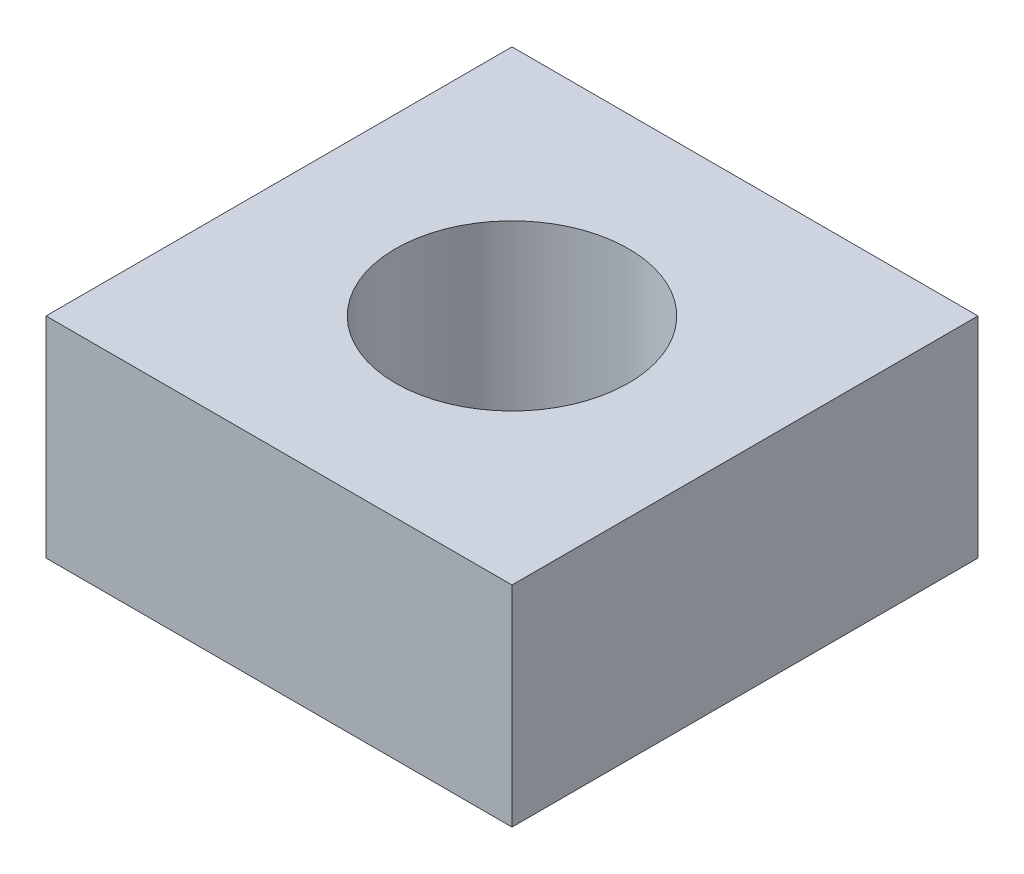
ISO-10303-21;
HEADER;
FILE_DESCRIPTION(('STEP AP214'),'2;1');
FILE_NAME('part.step','',(''),(''),'','','');
FILE_SCHEMA(('AUTOMOTIVE_DESIGN { 1 0 10303 214 1 1 1 1 }'));
ENDSEC;
DATA;
#1=APPLICATION_CONTEXT('core data for automotive mechanical design processes');
#2=APPLICATION_PROTOCOL_DEFINITION('international standard','automotive_design',2000,#1);
#3=PRODUCT_CONTEXT('',#1,'mechanical');
#4=PRODUCT('Part','Part','',(#3));
#5=PRODUCT_RELATED_PRODUCT_CATEGORY('part','',(#4));
#6=PRODUCT_DEFINITION_FORMATION('','',#4);
#7=PRODUCT_DEFINITION_CONTEXT('part definition',#1,'design');
#8=PRODUCT_DEFINITION('design','',#6,#7);
#9=PRODUCT_DEFINITION_SHAPE('','',#8);
#10=(LENGTH_UNIT() NAMED_UNIT(*) SI_UNIT(.MILLI.,.METRE.));
#11=(NAMED_UNIT(*) PLANE_ANGLE_UNIT() SI_UNIT($,.RADIAN.));
#12=(NAMED_UNIT(*) SI_UNIT($,.STERADIAN.) SOLID_ANGLE_UNIT());
#13=UNCERTAINTY_MEASURE_WITH_UNIT(LENGTH_MEASURE(1.E-05),#10,'distance_accuracy_value','');
#14=(GEOMETRIC_REPRESENTATION_CONTEXT(3) GLOBAL_UNCERTAINTY_ASSIGNED_CONTEXT((#13)) GLOBAL_UNIT_ASSIGNED_CONTEXT((#10,
#11,#12)) REPRESENTATION_CONTEXT('',''));
#15=CARTESIAN_POINT('',(0.,0.,0.));
#16=DIRECTION('',(0.,0.,1.));
#17=DIRECTION('',(1.,0.,0.));
#18=AXIS2_PLACEMENT_3D('',#15,#16,#17);
#19=CARTESIAN_POINT('',(0.,4.5,0.));
#20=DIRECTION('',(0.,1.,0.));
#21=DIRECTION('',(0.,0.,1.));
#22=AXIS2_PLACEMENT_3D('',#19,#20,#21);
#23=PLANE('',#22);
#24=DIRECTION('',(0.,0.,1.));
#25=VECTOR('',#24,1.);
#26=CARTESIAN_POINT('',(-5.,4.5,5.));
#27=LINE('',#26,#25);
#28=CARTESIAN_POINT('',(-5.,4.5,-5.));
#29=VERTEX_POINT('',#28);
#30=CARTESIAN_POINT('',(-5.,4.5,5.));
#31=VERTEX_POINT('',#30);
#32=EDGE_CURVE('E85',#29,#31,#27,.T.);
#33=ORIENTED_EDGE('',*,*,#32,.T.);
#34=DIRECTION('',(1.,0.,0.));
#35=VECTOR('',#34,1.);
#36=CARTESIAN_POINT('',(5.,4.5,5.));
#37=LINE('',#36,#35);
#38=CARTESIAN_POINT('',(5.,4.5,5.));
#39=VERTEX_POINT('',#38);
#40=EDGE_CURVE('E80',#31,#39,#37,.T.);
#41=ORIENTED_EDGE('',*,*,#40,.T.);
#42=DIRECTION('',(0.,0.,-1.));
#43=VECTOR('',#42,1.);
#44=CARTESIAN_POINT('',(5.,4.5,5.));
#45=LINE('',#44,#43);
#46=CARTESIAN_POINT('',(5.,4.5,-5.));
#47=VERTEX_POINT('',#46);
#48=EDGE_CURVE('E83',#39,#47,#45,.T.);
#49=ORIENTED_EDGE('',*,*,#48,.T.);
#50=DIRECTION('',(-1.,0.,0.));
#51=VECTOR('',#50,1.);
#52=CARTESIAN_POINT('',(5.,4.5,-5.));
#53=LINE('',#52,#51);
#54=EDGE_CURVE('E50',#47,#29,#53,.T.);
#55=ORIENTED_EDGE('',*,*,#54,.T.);
#56=EDGE_LOOP('',(#33,#41,#49,#55));
#57=FACE_BOUND('',#56,.T.);
#58=CARTESIAN_POINT('',(0.,4.5,0.));
#59=DIRECTION('',(0.,1.,0.));
#60=DIRECTION('',(0.,0.,1.));
#61=AXIS2_PLACEMENT_3D('',#58,#59,#60);
#62=CIRCLE('',#61,2.5);
#63=CARTESIAN_POINT('',(0.,4.5,2.5));
#64=VERTEX_POINT('',#63);
#65=EDGE_CURVE('E100',#64,#64,#62,.T.);
#66=ORIENTED_EDGE('',*,*,#65,.F.);
#67=EDGE_LOOP('',(#66));
#68=FACE_BOUND('',#67,.T.);
#69=ADVANCED_FACE('F33',(#57,#68),#23,.T.);
#70=CARTESIAN_POINT('',(0.,0.,0.));
#71=DIRECTION('',(0.,1.,0.));
#72=DIRECTION('',(0.,0.,1.));
#73=AXIS2_PLACEMENT_3D('',#70,#71,#72);
#74=PLANE('',#73);
#75=DIRECTION('',(0.,0.,1.));
#76=VECTOR('',#75,1.);
#77=CARTESIAN_POINT('',(-5.,0.,5.));
#78=LINE('',#77,#76);
#79=CARTESIAN_POINT('',(-5.,0.,-5.));
#80=VERTEX_POINT('',#79);
#81=CARTESIAN_POINT('',(-5.,0.,5.));
#82=VERTEX_POINT('',#81);
#83=EDGE_CURVE('E97',#80,#82,#78,.T.);
#84=ORIENTED_EDGE('',*,*,#83,.F.);
#85=DIRECTION('',(-1.,0.,0.));
#86=VECTOR('',#85,1.);
#87=CARTESIAN_POINT('',(5.,0.,-5.));
#88=LINE('',#87,#86);
#89=CARTESIAN_POINT('',(5.,0.,-5.));
#90=VERTEX_POINT('',#89);
#91=EDGE_CURVE('E73',#90,#80,#88,.T.);
#92=ORIENTED_EDGE('',*,*,#91,.F.);
#93=DIRECTION('',(0.,0.,-1.));
#94=VECTOR('',#93,1.);
#95=CARTESIAN_POINT('',(5.,0.,5.));
#96=LINE('',#95,#94);
#97=CARTESIAN_POINT('',(5.,0.,5.));
#98=VERTEX_POINT('',#97);
#99=EDGE_CURVE('E67',#98,#90,#96,.T.);
#100=ORIENTED_EDGE('',*,*,#99,.F.);
#101=DIRECTION('',(1.,0.,0.));
#102=VECTOR('',#101,1.);
#103=CARTESIAN_POINT('',(5.,0.,5.));
#104=LINE('',#103,#102);
#105=EDGE_CURVE('E89',#82,#98,#104,.T.);
#106=ORIENTED_EDGE('',*,*,#105,.F.);
#107=EDGE_LOOP('',(#84,#92,#100,#106));
#108=FACE_BOUND('',#107,.T.);
#109=CARTESIAN_POINT('',(0.,0.,0.));
#110=DIRECTION('',(0.,1.,0.));
#111=DIRECTION('',(0.,0.,1.));
#112=AXIS2_PLACEMENT_3D('',#109,#110,#111);
#113=CIRCLE('',#112,2.5);
#114=CARTESIAN_POINT('',(0.,0.,2.5));
#115=VERTEX_POINT('',#114);
#116=EDGE_CURVE('E112',#115,#115,#113,.T.);
#117=ORIENTED_EDGE('',*,*,#116,.T.);
#118=EDGE_LOOP('',(#117));
#119=FACE_BOUND('',#118,.T.);
#120=ADVANCED_FACE('F108',(#108,#119),#74,.F.);
#121=CARTESIAN_POINT('',(-5.,4.5,5.));
#122=DIRECTION('',(1.,0.,0.));
#123=DIRECTION('',(0.,0.,-1.));
#124=AXIS2_PLACEMENT_3D('',#121,#122,#123);
#125=PLANE('',#124);
#126=ORIENTED_EDGE('',*,*,#83,.T.);
#127=DIRECTION('',(0.,-1.,0.));
#128=VECTOR('',#127,1.);
#129=CARTESIAN_POINT('',(-5.,4.5,5.));
#130=LINE('',#129,#128);
#131=EDGE_CURVE('E11',#31,#82,#130,.T.);
#132=ORIENTED_EDGE('',*,*,#131,.F.);
#133=ORIENTED_EDGE('',*,*,#32,.F.);
#134=DIRECTION('',(0.,-1.,0.));
#135=VECTOR('',#134,1.);
#136=CARTESIAN_POINT('',(-5.,4.5,-5.));
#137=LINE('',#136,#135);
#138=EDGE_CURVE('E93',#29,#80,#137,.T.);
#139=ORIENTED_EDGE('',*,*,#138,.T.);
#140=EDGE_LOOP('',(#126,#132,#133,#139));
#141=FACE_BOUND('',#140,.T.);
#142=ADVANCED_FACE('F35',(#141),#125,.F.);
#143=CARTESIAN_POINT('',(5.,4.5,5.));
#144=DIRECTION('',(0.,0.,-1.));
#145=DIRECTION('',(-1.,0.,0.));
#146=AXIS2_PLACEMENT_3D('',#143,#144,#145);
#147=PLANE('',#146);
#148=ORIENTED_EDGE('',*,*,#105,.T.);
#149=DIRECTION('',(0.,-1.,0.));
#150=VECTOR('',#149,1.);
#151=CARTESIAN_POINT('',(5.,4.5,5.));
#152=LINE('',#151,#150);
#153=EDGE_CURVE('E42',#39,#98,#152,.T.);
#154=ORIENTED_EDGE('',*,*,#153,.F.);
#155=ORIENTED_EDGE('',*,*,#40,.F.);
#156=ORIENTED_EDGE('',*,*,#131,.T.);
#157=EDGE_LOOP('',(#148,#154,#155,#156));
#158=FACE_BOUND('',#157,.T.);
#159=ADVANCED_FACE('F88',(#158),#147,.F.);
#160=CARTESIAN_POINT('',(5.,4.5,5.));
#161=DIRECTION('',(-1.,0.,0.));
#162=DIRECTION('',(0.,0.,1.));
#163=AXIS2_PLACEMENT_3D('',#160,#161,#162);
#164=PLANE('',#163);
#165=ORIENTED_EDGE('',*,*,#99,.T.);
#166=DIRECTION('',(0.,-1.,0.));
#167=VECTOR('',#166,1.);
#168=CARTESIAN_POINT('',(5.,4.5,-5.));
#169=LINE('',#168,#167);
#170=EDGE_CURVE('E90',#47,#90,#169,.T.);
#171=ORIENTED_EDGE('',*,*,#170,.F.);
#172=ORIENTED_EDGE('',*,*,#48,.F.);
#173=ORIENTED_EDGE('',*,*,#153,.T.);
#174=EDGE_LOOP('',(#165,#171,#172,#173));
#175=FACE_BOUND('',#174,.T.);
#176=ADVANCED_FACE('F91',(#175),#164,.F.);
#177=CARTESIAN_POINT('',(5.,4.5,-5.));
#178=DIRECTION('',(0.,0.,1.));
#179=DIRECTION('',(1.,0.,0.));
#180=AXIS2_PLACEMENT_3D('',#177,#178,#179);
#181=PLANE('',#180);
#182=ORIENTED_EDGE('',*,*,#91,.T.);
#183=ORIENTED_EDGE('',*,*,#138,.F.);
#184=ORIENTED_EDGE('',*,*,#54,.F.);
#185=ORIENTED_EDGE('',*,*,#170,.T.);
#186=EDGE_LOOP('',(#182,#183,#184,#185));
#187=FACE_BOUND('',#186,.T.);
#188=ADVANCED_FACE('F105',(#187),#181,.F.);
#189=CARTESIAN_POINT('',(0.,4.5,0.));
#190=DIRECTION('',(0.,-1.,0.));
#191=DIRECTION('',(0.,0.,-1.));
#192=AXIS2_PLACEMENT_3D('',#189,#190,#191);
#193=CYLINDRICAL_SURFACE('',#192,2.5);
#194=ORIENTED_EDGE('',*,*,#65,.T.);
#195=EDGE_LOOP('',(#194));
#196=FACE_BOUND('',#195,.T.);
#197=ORIENTED_EDGE('',*,*,#116,.F.);
#198=EDGE_LOOP('',(#197));
#199=FACE_BOUND('',#198,.T.);
#200=ADVANCED_FACE('F118',(#196,#199),#193,.F.);
#201=CLOSED_SHELL('',(#69,#120,#142,#159,#176,#188,#200));
#202=MANIFOLD_SOLID_BREP('B2',#201);
#203=ADVANCED_BREP_SHAPE_REPRESENTATION('',(#18,#202),#14);
#204=SHAPE_DEFINITION_REPRESENTATION(#9,#203);
ENDSEC;
END-ISO-10303-21;
